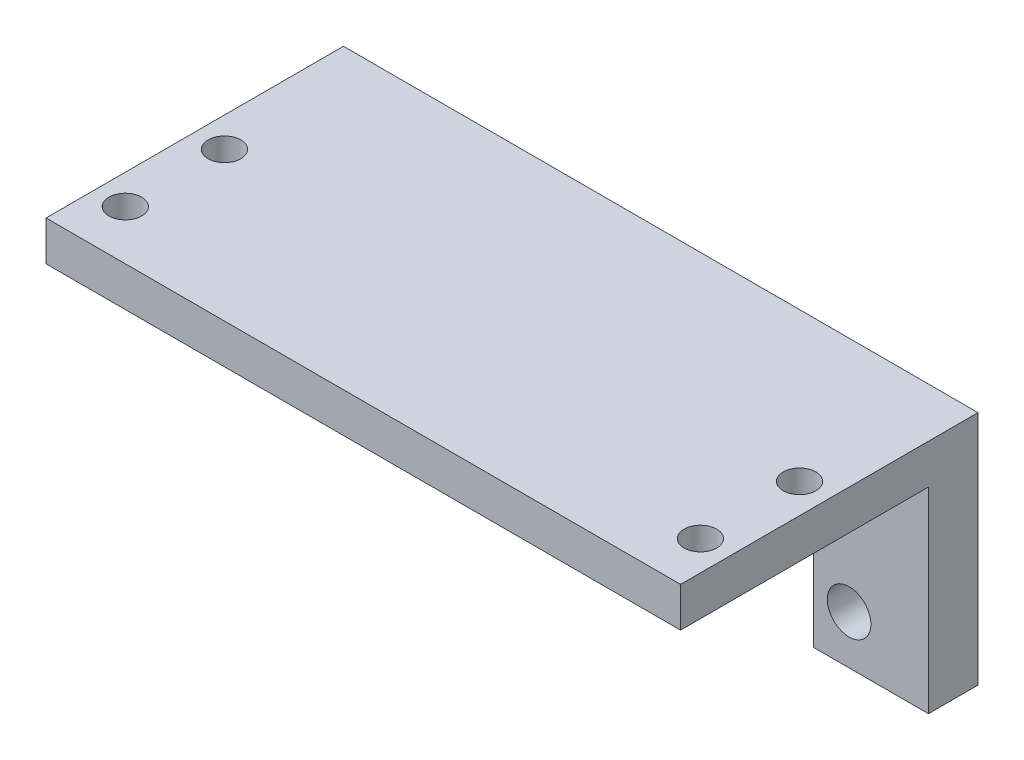
ISO-10303-21;
HEADER;
FILE_DESCRIPTION(('STEP AP214'),'2;1');
FILE_NAME('part.step','',(''),(''),'','','');
FILE_SCHEMA(('AUTOMOTIVE_DESIGN { 1 0 10303 214 1 1 1 1 }'));
ENDSEC;
DATA;
#1=APPLICATION_CONTEXT('core data for automotive mechanical design processes');
#2=APPLICATION_PROTOCOL_DEFINITION('international standard','automotive_design',2000,#1);
#3=PRODUCT_CONTEXT('',#1,'mechanical');
#4=PRODUCT('Part','Part','',(#3));
#5=PRODUCT_RELATED_PRODUCT_CATEGORY('part','',(#4));
#6=PRODUCT_DEFINITION_FORMATION('','',#4);
#7=PRODUCT_DEFINITION_CONTEXT('part definition',#1,'design');
#8=PRODUCT_DEFINITION('design','',#6,#7);
#9=PRODUCT_DEFINITION_SHAPE('','',#8);
#10=(LENGTH_UNIT() NAMED_UNIT(*) SI_UNIT(.MILLI.,.METRE.));
#11=(NAMED_UNIT(*) PLANE_ANGLE_UNIT() SI_UNIT($,.RADIAN.));
#12=(NAMED_UNIT(*) SI_UNIT($,.STERADIAN.) SOLID_ANGLE_UNIT());
#13=UNCERTAINTY_MEASURE_WITH_UNIT(LENGTH_MEASURE(1.E-05),#10,'distance_accuracy_value','');
#14=(GEOMETRIC_REPRESENTATION_CONTEXT(3) GLOBAL_UNCERTAINTY_ASSIGNED_CONTEXT((#13)) GLOBAL_UNIT_ASSIGNED_CONTEXT((#10,
#11,#12)) REPRESENTATION_CONTEXT('',''));
#15=CARTESIAN_POINT('',(0.,0.,0.));
#16=DIRECTION('',(0.,0.,1.));
#17=DIRECTION('',(1.,0.,0.));
#18=AXIS2_PLACEMENT_3D('',#15,#16,#17);
#19=CARTESIAN_POINT('',(0.,0.,5.));
#20=DIRECTION('',(0.,0.,-1.));
#21=DIRECTION('',(-1.,0.,0.));
#22=AXIS2_PLACEMENT_3D('',#19,#20,#21);
#23=PLANE('',#22);
#24=DIRECTION('',(0.,-1.,0.));
#25=VECTOR('',#24,1.);
#26=CARTESIAN_POINT('',(20.4,-19.8,5.));
#27=LINE('',#26,#25);
#28=CARTESIAN_POINT('',(20.4,0.,5.));
#29=VERTEX_POINT('',#28);
#30=CARTESIAN_POINT('',(20.4,-19.8,5.));
#31=VERTEX_POINT('',#30);
#32=EDGE_CURVE('E206',#29,#31,#27,.T.);
#33=ORIENTED_EDGE('',*,*,#32,.T.);
#34=DIRECTION('',(1.,0.,0.));
#35=VECTOR('',#34,1.);
#36=CARTESIAN_POINT('',(32.,-19.8,5.));
#37=LINE('',#36,#35);
#38=CARTESIAN_POINT('',(32.,-19.8,5.));
#39=VERTEX_POINT('',#38);
#40=EDGE_CURVE('E74',#31,#39,#37,.T.);
#41=ORIENTED_EDGE('',*,*,#40,.T.);
#42=DIRECTION('',(0.,1.,0.));
#43=VECTOR('',#42,1.);
#44=CARTESIAN_POINT('',(32.,0.,5.));
#45=LINE('',#44,#43);
#46=CARTESIAN_POINT('',(32.,0.,5.));
#47=VERTEX_POINT('',#46);
#48=EDGE_CURVE('E210',#39,#47,#45,.T.);
#49=ORIENTED_EDGE('',*,*,#48,.T.);
#50=DIRECTION('',(-1.,0.,0.));
#51=VECTOR('',#50,1.);
#52=CARTESIAN_POINT('',(20.4,0.,5.));
#53=LINE('',#52,#51);
#54=EDGE_CURVE('E213',#47,#29,#53,.T.);
#55=ORIENTED_EDGE('',*,*,#54,.T.);
#56=EDGE_LOOP('',(#33,#41,#49,#55));
#57=FACE_BOUND('',#56,.T.);
#58=CARTESIAN_POINT('',(24.,-4.9,5.));
#59=DIRECTION('',(0.,0.,1.));
#60=DIRECTION('',(1.,0.,0.));
#61=AXIS2_PLACEMENT_3D('',#58,#59,#60);
#62=CIRCLE('',#61,2.2);
#63=CARTESIAN_POINT('',(26.2,-4.9,5.));
#64=VERTEX_POINT('',#63);
#65=EDGE_CURVE('E200',#64,#64,#62,.T.);
#66=ORIENTED_EDGE('',*,*,#65,.F.);
#67=EDGE_LOOP('',(#66));
#68=FACE_BOUND('',#67,.T.);
#69=CARTESIAN_POINT('',(24.,-14.9,5.));
#70=DIRECTION('',(0.,0.,1.));
#71=DIRECTION('',(-1.,0.,0.));
#72=AXIS2_PLACEMENT_3D('',#69,#70,#71);
#73=CIRCLE('',#72,2.2);
#74=CARTESIAN_POINT('',(21.8,-14.9,5.));
#75=VERTEX_POINT('',#74);
#76=EDGE_CURVE('E194',#75,#75,#73,.T.);
#77=ORIENTED_EDGE('',*,*,#76,.F.);
#78=EDGE_LOOP('',(#77));
#79=FACE_BOUND('',#78,.T.);
#80=ADVANCED_FACE('F33',(#57,#68,#79),#23,.F.);
#81=CARTESIAN_POINT('',(0.,0.,0.));
#82=DIRECTION('',(0.,0.,-1.));
#83=DIRECTION('',(-1.,0.,0.));
#84=AXIS2_PLACEMENT_3D('',#81,#82,#83);
#85=PLANE('',#84);
#86=CARTESIAN_POINT('',(24.,-4.9,0.));
#87=DIRECTION('',(0.,0.,1.));
#88=DIRECTION('',(1.,0.,0.));
#89=AXIS2_PLACEMENT_3D('',#86,#87,#88);
#90=CIRCLE('',#89,2.2);
#91=CARTESIAN_POINT('',(26.2,-4.9,0.));
#92=VERTEX_POINT('',#91);
#93=EDGE_CURVE('E197',#92,#92,#90,.T.);
#94=ORIENTED_EDGE('',*,*,#93,.T.);
#95=EDGE_LOOP('',(#94));
#96=FACE_BOUND('',#95,.T.);
#97=DIRECTION('',(0.,-1.,0.));
#98=VECTOR('',#97,1.);
#99=CARTESIAN_POINT('',(20.4,-19.8,0.));
#100=LINE('',#99,#98);
#101=CARTESIAN_POINT('',(20.4,0.,0.));
#102=VERTEX_POINT('',#101);
#103=CARTESIAN_POINT('',(20.4,-19.8,0.));
#104=VERTEX_POINT('',#103);
#105=EDGE_CURVE('E203',#102,#104,#100,.T.);
#106=ORIENTED_EDGE('',*,*,#105,.F.);
#107=DIRECTION('',(-1.,0.,0.));
#108=VECTOR('',#107,1.);
#109=CARTESIAN_POINT('',(-32.,0.,0.));
#110=LINE('',#109,#108);
#111=CARTESIAN_POINT('',(-20.4,0.,0.));
#112=VERTEX_POINT('',#111);
#113=EDGE_CURVE('E164',#102,#112,#110,.T.);
#114=ORIENTED_EDGE('',*,*,#113,.T.);
#115=DIRECTION('',(0.,1.,0.));
#116=VECTOR('',#115,1.);
#117=CARTESIAN_POINT('',(-20.4,-19.8,0.));
#118=LINE('',#117,#116);
#119=CARTESIAN_POINT('',(-20.4,-19.8,0.));
#120=VERTEX_POINT('',#119);
#121=EDGE_CURVE('E131',#120,#112,#118,.T.);
#122=ORIENTED_EDGE('',*,*,#121,.F.);
#123=DIRECTION('',(1.,0.,0.));
#124=VECTOR('',#123,1.);
#125=CARTESIAN_POINT('',(-32.,-19.8,0.));
#126=LINE('',#125,#124);
#127=CARTESIAN_POINT('',(-32.,-19.8,0.));
#128=VERTEX_POINT('',#127);
#129=EDGE_CURVE('E326',#128,#120,#126,.T.);
#130=ORIENTED_EDGE('',*,*,#129,.F.);
#131=DIRECTION('',(0.,-1.,0.));
#132=VECTOR('',#131,1.);
#133=CARTESIAN_POINT('',(-32.,4.,0.));
#134=LINE('',#133,#132);
#135=CARTESIAN_POINT('',(-32.,4.,0.));
#136=VERTEX_POINT('',#135);
#137=EDGE_CURVE('E135',#136,#128,#134,.T.);
#138=ORIENTED_EDGE('',*,*,#137,.F.);
#139=DIRECTION('',(-1.,0.,0.));
#140=VECTOR('',#139,1.);
#141=CARTESIAN_POINT('',(-32.,4.,0.));
#142=LINE('',#141,#140);
#143=CARTESIAN_POINT('',(32.,4.,0.));
#144=VERTEX_POINT('',#143);
#145=EDGE_CURVE('E167',#144,#136,#142,.T.);
#146=ORIENTED_EDGE('',*,*,#145,.F.);
#147=DIRECTION('',(0.,1.,0.));
#148=VECTOR('',#147,1.);
#149=CARTESIAN_POINT('',(32.,0.,0.));
#150=LINE('',#149,#148);
#151=CARTESIAN_POINT('',(32.,-19.8,0.));
#152=VERTEX_POINT('',#151);
#153=EDGE_CURVE('E208',#152,#144,#150,.T.);
#154=ORIENTED_EDGE('',*,*,#153,.F.);
#155=DIRECTION('',(1.,0.,0.));
#156=VECTOR('',#155,1.);
#157=CARTESIAN_POINT('',(32.,-19.8,0.));
#158=LINE('',#157,#156);
#159=EDGE_CURVE('E71',#104,#152,#158,.T.);
#160=ORIENTED_EDGE('',*,*,#159,.F.);
#161=EDGE_LOOP('',(#106,#114,#122,#130,#138,#146,#154,#160));
#162=FACE_BOUND('',#161,.T.);
#163=CARTESIAN_POINT('',(24.,-14.9,0.));
#164=DIRECTION('',(0.,0.,1.));
#165=DIRECTION('',(-1.,0.,0.));
#166=AXIS2_PLACEMENT_3D('',#163,#164,#165);
#167=CIRCLE('',#166,2.2);
#168=CARTESIAN_POINT('',(21.8,-14.9,0.));
#169=VERTEX_POINT('',#168);
#170=EDGE_CURVE('E193',#169,#169,#167,.T.);
#171=ORIENTED_EDGE('',*,*,#170,.T.);
#172=EDGE_LOOP('',(#171));
#173=FACE_BOUND('',#172,.T.);
#174=CARTESIAN_POINT('',(-24.,-14.9,0.));
#175=DIRECTION('',(0.,0.,1.));
#176=DIRECTION('',(1.,0.,0.));
#177=AXIS2_PLACEMENT_3D('',#174,#175,#176);
#178=CIRCLE('',#177,2.2);
#179=CARTESIAN_POINT('',(-21.8,-14.9,0.));
#180=VERTEX_POINT('',#179);
#181=EDGE_CURVE('E320',#180,#180,#178,.T.);
#182=ORIENTED_EDGE('',*,*,#181,.T.);
#183=EDGE_LOOP('',(#182));
#184=FACE_BOUND('',#183,.T.);
#185=CARTESIAN_POINT('',(-24.,-4.9,0.));
#186=DIRECTION('',(0.,0.,1.));
#187=DIRECTION('',(-1.,0.,0.));
#188=AXIS2_PLACEMENT_3D('',#185,#186,#187);
#189=CIRCLE('',#188,2.2);
#190=CARTESIAN_POINT('',(-26.2,-4.9,0.));
#191=VERTEX_POINT('',#190);
#192=EDGE_CURVE('E317',#191,#191,#189,.T.);
#193=ORIENTED_EDGE('',*,*,#192,.T.);
#194=EDGE_LOOP('',(#193));
#195=FACE_BOUND('',#194,.T.);
#196=ADVANCED_FACE('F227',(#96,#162,#173,#184,#195),#85,.T.);
#197=CARTESIAN_POINT('',(20.4,-19.8,5.));
#198=DIRECTION('',(1.,0.,0.));
#199=DIRECTION('',(0.,1.,0.));
#200=AXIS2_PLACEMENT_3D('',#197,#198,#199);
#201=PLANE('',#200);
#202=ORIENTED_EDGE('',*,*,#105,.T.);
#203=DIRECTION('',(0.,0.,-1.));
#204=VECTOR('',#203,1.);
#205=CARTESIAN_POINT('',(20.4,-19.8,5.));
#206=LINE('',#205,#204);
#207=EDGE_CURVE('E11',#31,#104,#206,.T.);
#208=ORIENTED_EDGE('',*,*,#207,.F.);
#209=ORIENTED_EDGE('',*,*,#32,.F.);
#210=DIRECTION('',(0.,0.,-1.));
#211=VECTOR('',#210,1.);
#212=CARTESIAN_POINT('',(20.4,0.,5.));
#213=LINE('',#212,#211);
#214=EDGE_CURVE('E57',#29,#102,#213,.T.);
#215=ORIENTED_EDGE('',*,*,#214,.T.);
#216=EDGE_LOOP('',(#202,#208,#209,#215));
#217=FACE_BOUND('',#216,.T.);
#218=ADVANCED_FACE('F35',(#217),#201,.F.);
#219=CARTESIAN_POINT('',(32.,-19.8,5.));
#220=DIRECTION('',(0.,1.,0.));
#221=DIRECTION('',(-1.,0.,0.));
#222=AXIS2_PLACEMENT_3D('',#219,#220,#221);
#223=PLANE('',#222);
#224=ORIENTED_EDGE('',*,*,#159,.T.);
#225=DIRECTION('',(0.,0.,-1.));
#226=VECTOR('',#225,1.);
#227=CARTESIAN_POINT('',(32.,-19.8,5.));
#228=LINE('',#227,#226);
#229=EDGE_CURVE('E41',#39,#152,#228,.T.);
#230=ORIENTED_EDGE('',*,*,#229,.F.);
#231=ORIENTED_EDGE('',*,*,#40,.F.);
#232=ORIENTED_EDGE('',*,*,#207,.T.);
#233=EDGE_LOOP('',(#224,#230,#231,#232));
#234=FACE_BOUND('',#233,.T.);
#235=ADVANCED_FACE('F245',(#234),#223,.F.);
#236=CARTESIAN_POINT('',(32.,0.,5.));
#237=DIRECTION('',(-1.,0.,0.));
#238=DIRECTION('',(0.,0.,1.));
#239=AXIS2_PLACEMENT_3D('',#236,#237,#238);
#240=PLANE('',#239);
#241=ORIENTED_EDGE('',*,*,#153,.T.);
#242=DIRECTION('',(0.,0.,-1.));
#243=VECTOR('',#242,1.);
#244=CARTESIAN_POINT('',(32.,4.,0.));
#245=LINE('',#244,#243);
#246=CARTESIAN_POINT('',(32.,4.,30.));
#247=VERTEX_POINT('',#246);
#248=EDGE_CURVE('E175',#247,#144,#245,.T.);
#249=ORIENTED_EDGE('',*,*,#248,.F.);
#250=DIRECTION('',(0.,-1.,0.));
#251=VECTOR('',#250,1.);
#252=CARTESIAN_POINT('',(32.,4.,30.));
#253=LINE('',#252,#251);
#254=CARTESIAN_POINT('',(32.,0.,30.));
#255=VERTEX_POINT('',#254);
#256=EDGE_CURVE('E178',#247,#255,#253,.T.);
#257=ORIENTED_EDGE('',*,*,#256,.T.);
#258=DIRECTION('',(0.,0.,-1.));
#259=VECTOR('',#258,1.);
#260=CARTESIAN_POINT('',(32.,0.,0.));
#261=LINE('',#260,#259);
#262=EDGE_CURVE('E171',#255,#47,#261,.T.);
#263=ORIENTED_EDGE('',*,*,#262,.T.);
#264=ORIENTED_EDGE('',*,*,#48,.F.);
#265=ORIENTED_EDGE('',*,*,#229,.T.);
#266=EDGE_LOOP('',(#241,#249,#257,#263,#264,#265));
#267=FACE_BOUND('',#266,.T.);
#268=ADVANCED_FACE('F222',(#267),#240,.F.);
#269=CARTESIAN_POINT('',(24.,-4.9,5.));
#270=DIRECTION('',(0.,0.,-1.));
#271=DIRECTION('',(-1.,0.,0.));
#272=AXIS2_PLACEMENT_3D('',#269,#270,#271);
#273=CYLINDRICAL_SURFACE('',#272,2.2);
#274=ORIENTED_EDGE('',*,*,#65,.T.);
#275=EDGE_LOOP('',(#274));
#276=FACE_BOUND('',#275,.T.);
#277=ORIENTED_EDGE('',*,*,#93,.F.);
#278=EDGE_LOOP('',(#277));
#279=FACE_BOUND('',#278,.T.);
#280=ADVANCED_FACE('F251',(#276,#279),#273,.F.);
#281=CARTESIAN_POINT('',(24.,-14.9,5.));
#282=DIRECTION('',(0.,0.,-1.));
#283=DIRECTION('',(-1.,0.,0.));
#284=AXIS2_PLACEMENT_3D('',#281,#282,#283);
#285=CYLINDRICAL_SURFACE('',#284,2.2);
#286=ORIENTED_EDGE('',*,*,#76,.T.);
#287=EDGE_LOOP('',(#286));
#288=FACE_BOUND('',#287,.T.);
#289=ORIENTED_EDGE('',*,*,#170,.F.);
#290=EDGE_LOOP('',(#289));
#291=FACE_BOUND('',#290,.T.);
#292=ADVANCED_FACE('F263',(#288,#291),#285,.F.);
#293=CARTESIAN_POINT('',(0.,0.,0.));
#294=DIRECTION('',(0.,-1.,0.));
#295=DIRECTION('',(0.,0.,-1.));
#296=AXIS2_PLACEMENT_3D('',#293,#294,#295);
#297=PLANE('',#296);
#298=DIRECTION('',(-1.,0.,0.));
#299=VECTOR('',#298,1.);
#300=CARTESIAN_POINT('',(-20.4,0.,5.));
#301=LINE('',#300,#299);
#302=CARTESIAN_POINT('',(-20.4,0.,5.));
#303=VERTEX_POINT('',#302);
#304=CARTESIAN_POINT('',(-32.,0.,5.));
#305=VERTEX_POINT('',#304);
#306=EDGE_CURVE('E129',#303,#305,#301,.T.);
#307=ORIENTED_EDGE('',*,*,#306,.F.);
#308=DIRECTION('',(0.,0.,-1.));
#309=VECTOR('',#308,1.);
#310=CARTESIAN_POINT('',(-20.4,0.,5.));
#311=LINE('',#310,#309);
#312=EDGE_CURVE('E142',#303,#112,#311,.T.);
#313=ORIENTED_EDGE('',*,*,#312,.T.);
#314=ORIENTED_EDGE('',*,*,#113,.F.);
#315=ORIENTED_EDGE('',*,*,#214,.F.);
#316=ORIENTED_EDGE('',*,*,#54,.F.);
#317=ORIENTED_EDGE('',*,*,#262,.F.);
#318=DIRECTION('',(1.,0.,0.));
#319=VECTOR('',#318,1.);
#320=CARTESIAN_POINT('',(32.,0.,30.));
#321=LINE('',#320,#319);
#322=CARTESIAN_POINT('',(-32.,0.,30.));
#323=VERTEX_POINT('',#322);
#324=EDGE_CURVE('E183',#323,#255,#321,.T.);
#325=ORIENTED_EDGE('',*,*,#324,.F.);
#326=DIRECTION('',(0.,0.,1.));
#327=VECTOR('',#326,1.);
#328=CARTESIAN_POINT('',(-32.,0.,30.));
#329=LINE('',#328,#327);
#330=EDGE_CURVE('E181',#305,#323,#329,.T.);
#331=ORIENTED_EDGE('',*,*,#330,.F.);
#332=EDGE_LOOP('',(#307,#313,#314,#315,#316,#317,#325,#331));
#333=FACE_BOUND('',#332,.T.);
#334=CARTESIAN_POINT('',(29.,0.,15.));
#335=DIRECTION('',(0.,1.,0.));
#336=DIRECTION('',(0.,0.,-1.));
#337=AXIS2_PLACEMENT_3D('',#334,#335,#336);
#338=CIRCLE('',#337,1.65);
#339=CARTESIAN_POINT('',(29.,0.,13.35));
#340=VERTEX_POINT('',#339);
#341=EDGE_CURVE('E137',#340,#340,#338,.T.);
#342=ORIENTED_EDGE('',*,*,#341,.T.);
#343=EDGE_LOOP('',(#342));
#344=FACE_BOUND('',#343,.T.);
#345=CARTESIAN_POINT('',(-29.,0.,25.));
#346=DIRECTION('',(0.,1.,0.));
#347=DIRECTION('',(0.,0.,1.));
#348=AXIS2_PLACEMENT_3D('',#345,#346,#347);
#349=CIRCLE('',#348,1.65);
#350=CARTESIAN_POINT('',(-29.,0.,26.65));
#351=VERTEX_POINT('',#350);
#352=EDGE_CURVE('E152',#351,#351,#349,.T.);
#353=ORIENTED_EDGE('',*,*,#352,.T.);
#354=EDGE_LOOP('',(#353));
#355=FACE_BOUND('',#354,.T.);
#356=CARTESIAN_POINT('',(-29.,0.,15.));
#357=DIRECTION('',(0.,1.,0.));
#358=DIRECTION('',(0.,0.,1.));
#359=AXIS2_PLACEMENT_3D('',#356,#357,#358);
#360=CIRCLE('',#359,1.65);
#361=CARTESIAN_POINT('',(-29.,0.,16.65));
#362=VERTEX_POINT('',#361);
#363=EDGE_CURVE('E158',#362,#362,#360,.T.);
#364=ORIENTED_EDGE('',*,*,#363,.T.);
#365=EDGE_LOOP('',(#364));
#366=FACE_BOUND('',#365,.T.);
#367=CARTESIAN_POINT('',(29.,0.,25.));
#368=DIRECTION('',(0.,1.,0.));
#369=DIRECTION('',(0.,0.,-1.));
#370=AXIS2_PLACEMENT_3D('',#367,#368,#369);
#371=CIRCLE('',#370,1.65);
#372=CARTESIAN_POINT('',(29.,0.,23.35));
#373=VERTEX_POINT('',#372);
#374=EDGE_CURVE('E147',#373,#373,#371,.T.);
#375=ORIENTED_EDGE('',*,*,#374,.T.);
#376=EDGE_LOOP('',(#375));
#377=FACE_BOUND('',#376,.T.);
#378=ADVANCED_FACE('F238',(#333,#344,#355,#366,#377),#297,.T.);
#379=CARTESIAN_POINT('',(0.,4.,0.));
#380=DIRECTION('',(0.,-1.,0.));
#381=DIRECTION('',(0.,0.,-1.));
#382=AXIS2_PLACEMENT_3D('',#379,#380,#381);
#383=PLANE('',#382);
#384=ORIENTED_EDGE('',*,*,#145,.T.);
#385=DIRECTION('',(0.,0.,1.));
#386=VECTOR('',#385,1.);
#387=CARTESIAN_POINT('',(-32.,4.,30.));
#388=LINE('',#387,#386);
#389=CARTESIAN_POINT('',(-32.,4.,30.));
#390=VERTEX_POINT('',#389);
#391=EDGE_CURVE('E170',#136,#390,#388,.T.);
#392=ORIENTED_EDGE('',*,*,#391,.T.);
#393=DIRECTION('',(1.,0.,0.));
#394=VECTOR('',#393,1.);
#395=CARTESIAN_POINT('',(32.,4.,30.));
#396=LINE('',#395,#394);
#397=EDGE_CURVE('E173',#390,#247,#396,.T.);
#398=ORIENTED_EDGE('',*,*,#397,.T.);
#399=ORIENTED_EDGE('',*,*,#248,.T.);
#400=EDGE_LOOP('',(#384,#392,#398,#399));
#401=FACE_BOUND('',#400,.T.);
#402=CARTESIAN_POINT('',(-29.,4.,15.));
#403=DIRECTION('',(0.,1.,0.));
#404=DIRECTION('',(0.,0.,1.));
#405=AXIS2_PLACEMENT_3D('',#402,#403,#404);
#406=CIRCLE('',#405,1.65);
#407=CARTESIAN_POINT('',(-29.,4.,16.65));
#408=VERTEX_POINT('',#407);
#409=EDGE_CURVE('E161',#408,#408,#406,.T.);
#410=ORIENTED_EDGE('',*,*,#409,.F.);
#411=EDGE_LOOP('',(#410));
#412=FACE_BOUND('',#411,.T.);
#413=CARTESIAN_POINT('',(-29.,4.,25.));
#414=DIRECTION('',(0.,1.,0.));
#415=DIRECTION('',(0.,0.,1.));
#416=AXIS2_PLACEMENT_3D('',#413,#414,#415);
#417=CIRCLE('',#416,1.65);
#418=CARTESIAN_POINT('',(-29.,4.,26.65));
#419=VERTEX_POINT('',#418);
#420=EDGE_CURVE('E155',#419,#419,#417,.T.);
#421=ORIENTED_EDGE('',*,*,#420,.F.);
#422=EDGE_LOOP('',(#421));
#423=FACE_BOUND('',#422,.T.);
#424=CARTESIAN_POINT('',(29.,4.,25.));
#425=DIRECTION('',(0.,1.,0.));
#426=DIRECTION('',(0.,0.,-1.));
#427=AXIS2_PLACEMENT_3D('',#424,#425,#426);
#428=CIRCLE('',#427,1.65);
#429=CARTESIAN_POINT('',(29.,4.,23.35));
#430=VERTEX_POINT('',#429);
#431=EDGE_CURVE('E149',#430,#430,#428,.T.);
#432=ORIENTED_EDGE('',*,*,#431,.F.);
#433=EDGE_LOOP('',(#432));
#434=FACE_BOUND('',#433,.T.);
#435=CARTESIAN_POINT('',(29.,4.,15.));
#436=DIRECTION('',(0.,1.,0.));
#437=DIRECTION('',(0.,0.,-1.));
#438=AXIS2_PLACEMENT_3D('',#435,#436,#437);
#439=CIRCLE('',#438,1.65);
#440=CARTESIAN_POINT('',(29.,4.,13.35));
#441=VERTEX_POINT('',#440);
#442=EDGE_CURVE('E140',#441,#441,#439,.T.);
#443=ORIENTED_EDGE('',*,*,#442,.F.);
#444=EDGE_LOOP('',(#443));
#445=FACE_BOUND('',#444,.T.);
#446=ADVANCED_FACE('F230',(#401,#412,#423,#434,#445),#383,.F.);
#447=CARTESIAN_POINT('',(-32.,4.,30.));
#448=DIRECTION('',(1.,0.,0.));
#449=DIRECTION('',(0.,0.,-1.));
#450=AXIS2_PLACEMENT_3D('',#447,#448,#449);
#451=PLANE('',#450);
#452=ORIENTED_EDGE('',*,*,#137,.T.);
#453=DIRECTION('',(0.,0.,-1.));
#454=VECTOR('',#453,1.);
#455=CARTESIAN_POINT('',(-32.,-19.8,5.));
#456=LINE('',#455,#454);
#457=CARTESIAN_POINT('',(-32.,-19.8,5.));
#458=VERTEX_POINT('',#457);
#459=EDGE_CURVE('E119',#458,#128,#456,.T.);
#460=ORIENTED_EDGE('',*,*,#459,.F.);
#461=DIRECTION('',(0.,-1.,0.));
#462=VECTOR('',#461,1.);
#463=CARTESIAN_POINT('',(-32.,0.,5.));
#464=LINE('',#463,#462);
#465=EDGE_CURVE('E48',#305,#458,#464,.T.);
#466=ORIENTED_EDGE('',*,*,#465,.F.);
#467=ORIENTED_EDGE('',*,*,#330,.T.);
#468=DIRECTION('',(0.,-1.,0.));
#469=VECTOR('',#468,1.);
#470=CARTESIAN_POINT('',(-32.,4.,30.));
#471=LINE('',#470,#469);
#472=EDGE_CURVE('E189',#390,#323,#471,.T.);
#473=ORIENTED_EDGE('',*,*,#472,.F.);
#474=ORIENTED_EDGE('',*,*,#391,.F.);
#475=EDGE_LOOP('',(#452,#460,#466,#467,#473,#474));
#476=FACE_BOUND('',#475,.T.);
#477=ADVANCED_FACE('F133',(#476),#451,.F.);
#478=CARTESIAN_POINT('',(32.,4.,30.));
#479=DIRECTION('',(0.,0.,-1.));
#480=DIRECTION('',(-1.,0.,0.));
#481=AXIS2_PLACEMENT_3D('',#478,#479,#480);
#482=PLANE('',#481);
#483=ORIENTED_EDGE('',*,*,#324,.T.);
#484=ORIENTED_EDGE('',*,*,#256,.F.);
#485=ORIENTED_EDGE('',*,*,#397,.F.);
#486=ORIENTED_EDGE('',*,*,#472,.T.);
#487=EDGE_LOOP('',(#483,#484,#485,#486));
#488=FACE_BOUND('',#487,.T.);
#489=ADVANCED_FACE('F270',(#488),#482,.F.);
#490=CARTESIAN_POINT('',(-29.,4.,15.));
#491=DIRECTION('',(0.,-1.,0.));
#492=DIRECTION('',(0.,0.,-1.));
#493=AXIS2_PLACEMENT_3D('',#490,#491,#492);
#494=CYLINDRICAL_SURFACE('',#493,1.65);
#495=ORIENTED_EDGE('',*,*,#409,.T.);
#496=EDGE_LOOP('',(#495));
#497=FACE_BOUND('',#496,.T.);
#498=ORIENTED_EDGE('',*,*,#363,.F.);
#499=EDGE_LOOP('',(#498));
#500=FACE_BOUND('',#499,.T.);
#501=ADVANCED_FACE('F273',(#497,#500),#494,.F.);
#502=CARTESIAN_POINT('',(-29.,4.,25.));
#503=DIRECTION('',(0.,-1.,0.));
#504=DIRECTION('',(0.,0.,-1.));
#505=AXIS2_PLACEMENT_3D('',#502,#503,#504);
#506=CYLINDRICAL_SURFACE('',#505,1.65);
#507=ORIENTED_EDGE('',*,*,#420,.T.);
#508=EDGE_LOOP('',(#507));
#509=FACE_BOUND('',#508,.T.);
#510=ORIENTED_EDGE('',*,*,#352,.F.);
#511=EDGE_LOOP('',(#510));
#512=FACE_BOUND('',#511,.T.);
#513=ADVANCED_FACE('F280',(#509,#512),#506,.F.);
#514=CARTESIAN_POINT('',(29.,4.,25.));
#515=DIRECTION('',(0.,-1.,0.));
#516=DIRECTION('',(0.,0.,-1.));
#517=AXIS2_PLACEMENT_3D('',#514,#515,#516);
#518=CYLINDRICAL_SURFACE('',#517,1.65);
#519=ORIENTED_EDGE('',*,*,#431,.T.);
#520=EDGE_LOOP('',(#519));
#521=FACE_BOUND('',#520,.T.);
#522=ORIENTED_EDGE('',*,*,#374,.F.);
#523=EDGE_LOOP('',(#522));
#524=FACE_BOUND('',#523,.T.);
#525=ADVANCED_FACE('F284',(#521,#524),#518,.F.);
#526=CARTESIAN_POINT('',(29.,4.,15.));
#527=DIRECTION('',(0.,-1.,0.));
#528=DIRECTION('',(0.,0.,-1.));
#529=AXIS2_PLACEMENT_3D('',#526,#527,#528);
#530=CYLINDRICAL_SURFACE('',#529,1.65);
#531=ORIENTED_EDGE('',*,*,#442,.T.);
#532=EDGE_LOOP('',(#531));
#533=FACE_BOUND('',#532,.T.);
#534=ORIENTED_EDGE('',*,*,#341,.F.);
#535=EDGE_LOOP('',(#534));
#536=FACE_BOUND('',#535,.T.);
#537=ADVANCED_FACE('F288',(#533,#536),#530,.F.);
#538=CARTESIAN_POINT('',(0.,0.,5.));
#539=DIRECTION('',(0.,0.,1.));
#540=DIRECTION('',(1.,0.,0.));
#541=AXIS2_PLACEMENT_3D('',#538,#539,#540);
#542=PLANE('',#541);
#543=CARTESIAN_POINT('',(-24.,-14.9,5.));
#544=DIRECTION('',(0.,0.,1.));
#545=DIRECTION('',(1.,0.,0.));
#546=AXIS2_PLACEMENT_3D('',#543,#544,#545);
#547=CIRCLE('',#546,2.2);
#548=CARTESIAN_POINT('',(-21.8,-14.9,5.));
#549=VERTEX_POINT('',#548);
#550=EDGE_CURVE('E323',#549,#549,#547,.T.);
#551=ORIENTED_EDGE('',*,*,#550,.F.);
#552=EDGE_LOOP('',(#551));
#553=FACE_BOUND('',#552,.T.);
#554=ORIENTED_EDGE('',*,*,#465,.T.);
#555=DIRECTION('',(1.,0.,0.));
#556=VECTOR('',#555,1.);
#557=CARTESIAN_POINT('',(-32.,-19.8,5.));
#558=LINE('',#557,#556);
#559=CARTESIAN_POINT('',(-20.4,-19.8,5.));
#560=VERTEX_POINT('',#559);
#561=EDGE_CURVE('E117',#458,#560,#558,.T.);
#562=ORIENTED_EDGE('',*,*,#561,.T.);
#563=DIRECTION('',(0.,1.,0.));
#564=VECTOR('',#563,1.);
#565=CARTESIAN_POINT('',(-20.4,-19.8,5.));
#566=LINE('',#565,#564);
#567=EDGE_CURVE('E124',#560,#303,#566,.T.);
#568=ORIENTED_EDGE('',*,*,#567,.T.);
#569=ORIENTED_EDGE('',*,*,#306,.T.);
#570=EDGE_LOOP('',(#554,#562,#568,#569));
#571=FACE_BOUND('',#570,.T.);
#572=CARTESIAN_POINT('',(-24.,-4.9,5.));
#573=DIRECTION('',(0.,0.,1.));
#574=DIRECTION('',(-1.,0.,0.));
#575=AXIS2_PLACEMENT_3D('',#572,#573,#574);
#576=CIRCLE('',#575,2.2);
#577=CARTESIAN_POINT('',(-26.2,-4.9,5.));
#578=VERTEX_POINT('',#577);
#579=EDGE_CURVE('E314',#578,#578,#576,.T.);
#580=ORIENTED_EDGE('',*,*,#579,.F.);
#581=EDGE_LOOP('',(#580));
#582=FACE_BOUND('',#581,.T.);
#583=ADVANCED_FACE('F126',(#553,#571,#582),#542,.T.);
#584=CARTESIAN_POINT('',(-32.,-19.8,5.));
#585=DIRECTION('',(0.,1.,0.));
#586=DIRECTION('',(-1.,0.,0.));
#587=AXIS2_PLACEMENT_3D('',#584,#585,#586);
#588=PLANE('',#587);
#589=ORIENTED_EDGE('',*,*,#129,.T.);
#590=DIRECTION('',(0.,0.,-1.));
#591=VECTOR('',#590,1.);
#592=CARTESIAN_POINT('',(-20.4,-19.8,5.));
#593=LINE('',#592,#591);
#594=EDGE_CURVE('E121',#560,#120,#593,.T.);
#595=ORIENTED_EDGE('',*,*,#594,.F.);
#596=ORIENTED_EDGE('',*,*,#561,.F.);
#597=ORIENTED_EDGE('',*,*,#459,.T.);
#598=EDGE_LOOP('',(#589,#595,#596,#597));
#599=FACE_BOUND('',#598,.T.);
#600=ADVANCED_FACE('F118',(#599),#588,.F.);
#601=CARTESIAN_POINT('',(-20.4,-19.8,5.));
#602=DIRECTION('',(-1.,0.,0.));
#603=DIRECTION('',(0.,-1.,0.));
#604=AXIS2_PLACEMENT_3D('',#601,#602,#603);
#605=PLANE('',#604);
#606=ORIENTED_EDGE('',*,*,#121,.T.);
#607=ORIENTED_EDGE('',*,*,#312,.F.);
#608=ORIENTED_EDGE('',*,*,#567,.F.);
#609=ORIENTED_EDGE('',*,*,#594,.T.);
#610=EDGE_LOOP('',(#606,#607,#608,#609));
#611=FACE_BOUND('',#610,.T.);
#612=ADVANCED_FACE('F295',(#611),#605,.F.);
#613=CARTESIAN_POINT('',(-24.,-14.9,5.));
#614=DIRECTION('',(0.,0.,-1.));
#615=DIRECTION('',(-1.,0.,0.));
#616=AXIS2_PLACEMENT_3D('',#613,#614,#615);
#617=CYLINDRICAL_SURFACE('',#616,2.2);
#618=ORIENTED_EDGE('',*,*,#550,.T.);
#619=EDGE_LOOP('',(#618));
#620=FACE_BOUND('',#619,.T.);
#621=ORIENTED_EDGE('',*,*,#181,.F.);
#622=EDGE_LOOP('',(#621));
#623=FACE_BOUND('',#622,.T.);
#624=ADVANCED_FACE('F298',(#620,#623),#617,.F.);
#625=CARTESIAN_POINT('',(-24.,-4.9,5.));
#626=DIRECTION('',(0.,0.,-1.));
#627=DIRECTION('',(-1.,0.,0.));
#628=AXIS2_PLACEMENT_3D('',#625,#626,#627);
#629=CYLINDRICAL_SURFACE('',#628,2.2);
#630=ORIENTED_EDGE('',*,*,#579,.T.);
#631=EDGE_LOOP('',(#630));
#632=FACE_BOUND('',#631,.T.);
#633=ORIENTED_EDGE('',*,*,#192,.F.);
#634=EDGE_LOOP('',(#633));
#635=FACE_BOUND('',#634,.T.);
#636=ADVANCED_FACE('F305',(#632,#635),#629,.F.);
#637=CLOSED_SHELL('',(#80,#196,#218,#235,#268,#280,#292,#378,#446,#477,#489,#501,#513,#525,#537,
#583,#600,#612,#624,#636));
#638=MANIFOLD_SOLID_BREP('B2',#637);
#639=ADVANCED_BREP_SHAPE_REPRESENTATION('',(#18,#638),#14);
#640=SHAPE_DEFINITION_REPRESENTATION(#9,#639);
ENDSEC;
END-ISO-10303-21;
